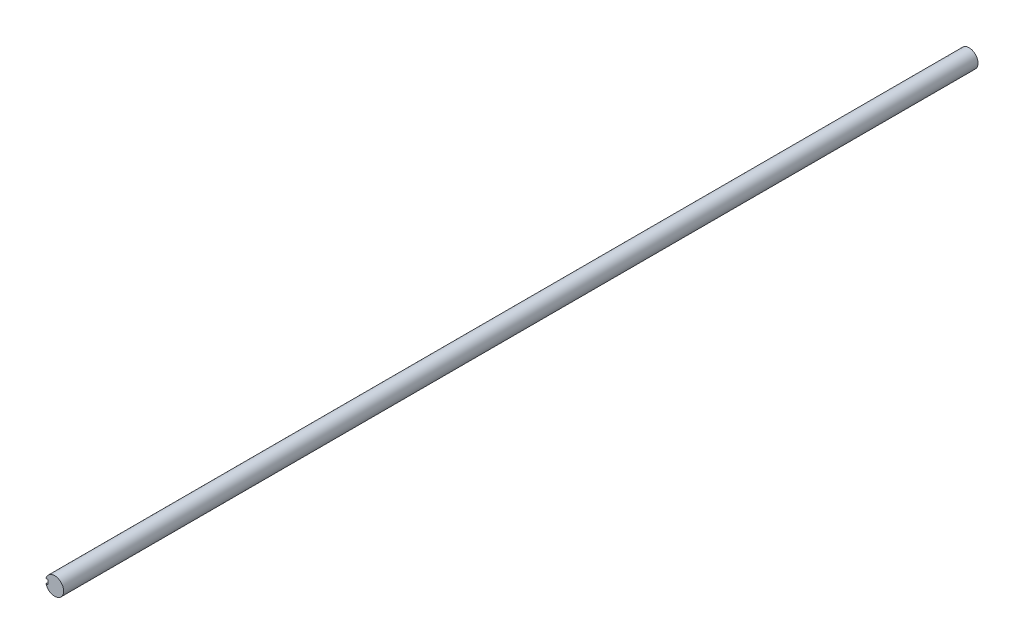
ISO-10303-21;
HEADER;
FILE_DESCRIPTION(('STEP AP214'),'2;1');
FILE_NAME('part.step','',(''),(''),'','','');
FILE_SCHEMA(('AUTOMOTIVE_DESIGN { 1 0 10303 214 1 1 1 1 }'));
ENDSEC;
DATA;
#1=APPLICATION_CONTEXT('core data for automotive mechanical design processes');
#2=APPLICATION_PROTOCOL_DEFINITION('international standard','automotive_design',2000,#1);
#3=PRODUCT_CONTEXT('',#1,'mechanical');
#4=PRODUCT('Part','Part','',(#3));
#5=PRODUCT_RELATED_PRODUCT_CATEGORY('part','',(#4));
#6=PRODUCT_DEFINITION_FORMATION('','',#4);
#7=PRODUCT_DEFINITION_CONTEXT('part definition',#1,'design');
#8=PRODUCT_DEFINITION('design','',#6,#7);
#9=PRODUCT_DEFINITION_SHAPE('','',#8);
#10=(LENGTH_UNIT() NAMED_UNIT(*) SI_UNIT(.MILLI.,.METRE.));
#11=(NAMED_UNIT(*) PLANE_ANGLE_UNIT() SI_UNIT($,.RADIAN.));
#12=(NAMED_UNIT(*) SI_UNIT($,.STERADIAN.) SOLID_ANGLE_UNIT());
#13=UNCERTAINTY_MEASURE_WITH_UNIT(LENGTH_MEASURE(1.E-05),#10,'distance_accuracy_value','');
#14=(GEOMETRIC_REPRESENTATION_CONTEXT(3) GLOBAL_UNCERTAINTY_ASSIGNED_CONTEXT((#13)) GLOBAL_UNIT_ASSIGNED_CONTEXT((#10,
#11,#12)) REPRESENTATION_CONTEXT('',''));
#15=CARTESIAN_POINT('',(0.,0.,0.));
#16=DIRECTION('',(0.,0.,1.));
#17=DIRECTION('',(1.,0.,0.));
#18=AXIS2_PLACEMENT_3D('',#15,#16,#17);
#19=CARTESIAN_POINT('',(0.,0.,486.69575));
#20=DIRECTION('',(0.,0.,-1.));
#21=DIRECTION('',(-1.,0.,0.));
#22=AXIS2_PLACEMENT_3D('',#19,#20,#21);
#23=CYLINDRICAL_SURFACE('',#22,4.7625);
#24=CARTESIAN_POINT('',(0.,0.,0.));
#25=DIRECTION('',(0.,0.,1.));
#26=DIRECTION('',(1.,0.,0.));
#27=AXIS2_PLACEMENT_3D('',#24,#25,#26);
#28=CIRCLE('',#27,4.7625);
#29=CARTESIAN_POINT('',(-4.61127079657821,-1.190625,0.));
#30=VERTEX_POINT('',#29);
#31=CARTESIAN_POINT('',(-4.61127079657821,1.190625,0.));
#32=VERTEX_POINT('',#31);
#33=EDGE_CURVE('E95',#30,#32,#28,.T.);
#34=ORIENTED_EDGE('',*,*,#33,.T.);
#35=DIRECTION('',(0.,0.,-1.));
#36=VECTOR('',#35,1.);
#37=CARTESIAN_POINT('',(-4.61127079657821,1.190625,486.69575));
#38=LINE('',#37,#36);
#39=CARTESIAN_POINT('',(-4.61127079657821,1.190625,486.69575));
#40=VERTEX_POINT('',#39);
#41=EDGE_CURVE('E11',#40,#32,#38,.T.);
#42=ORIENTED_EDGE('',*,*,#41,.F.);
#43=CARTESIAN_POINT('',(0.,0.,486.69575));
#44=DIRECTION('',(0.,0.,1.));
#45=DIRECTION('',(1.,0.,0.));
#46=AXIS2_PLACEMENT_3D('',#43,#44,#45);
#47=CIRCLE('',#46,4.7625);
#48=CARTESIAN_POINT('',(-4.61127079657821,-1.190625,486.69575));
#49=VERTEX_POINT('',#48);
#50=EDGE_CURVE('E83',#49,#40,#47,.T.);
#51=ORIENTED_EDGE('',*,*,#50,.F.);
#52=DIRECTION('',(0.,0.,-1.));
#53=VECTOR('',#52,1.);
#54=CARTESIAN_POINT('',(-4.61127079657821,-1.190625,486.69575));
#55=LINE('',#54,#53);
#56=EDGE_CURVE('E91',#49,#30,#55,.T.);
#57=ORIENTED_EDGE('',*,*,#56,.T.);
#58=EDGE_LOOP('',(#34,#42,#51,#57));
#59=FACE_BOUND('',#58,.T.);
#60=ADVANCED_FACE('F32',(#59),#23,.T.);
#61=CARTESIAN_POINT('',(-4.61127079657821,1.190625,486.69575));
#62=DIRECTION('',(0.,1.,0.));
#63=DIRECTION('',(-1.,0.,0.));
#64=AXIS2_PLACEMENT_3D('',#61,#62,#63);
#65=PLANE('',#64);
#66=DIRECTION('',(1.,0.,0.));
#67=VECTOR('',#66,1.);
#68=CARTESIAN_POINT('',(-4.61127079657821,1.190625,0.));
#69=LINE('',#68,#67);
#70=CARTESIAN_POINT('',(-3.571875,1.190625,0.));
#71=VERTEX_POINT('',#70);
#72=EDGE_CURVE('E87',#32,#71,#69,.T.);
#73=ORIENTED_EDGE('',*,*,#72,.T.);
#74=DIRECTION('',(0.,0.,-1.));
#75=VECTOR('',#74,1.);
#76=CARTESIAN_POINT('',(-3.571875,1.190625,486.69575));
#77=LINE('',#76,#75);
#78=CARTESIAN_POINT('',(-3.571875,1.190625,486.69575));
#79=VERTEX_POINT('',#78);
#80=EDGE_CURVE('E40',#79,#71,#77,.T.);
#81=ORIENTED_EDGE('',*,*,#80,.F.);
#82=DIRECTION('',(1.,0.,0.));
#83=VECTOR('',#82,1.);
#84=CARTESIAN_POINT('',(-4.61127079657821,1.190625,486.69575));
#85=LINE('',#84,#83);
#86=EDGE_CURVE('E78',#40,#79,#85,.T.);
#87=ORIENTED_EDGE('',*,*,#86,.F.);
#88=ORIENTED_EDGE('',*,*,#41,.T.);
#89=EDGE_LOOP('',(#73,#81,#87,#88));
#90=FACE_BOUND('',#89,.T.);
#91=ADVANCED_FACE('F86',(#90),#65,.F.);
#92=CARTESIAN_POINT('',(-3.571875,1.190625,486.69575));
#93=DIRECTION('',(1.,0.,0.));
#94=DIRECTION('',(0.,1.,0.));
#95=AXIS2_PLACEMENT_3D('',#92,#93,#94);
#96=PLANE('',#95);
#97=DIRECTION('',(0.,-1.,0.));
#98=VECTOR('',#97,1.);
#99=CARTESIAN_POINT('',(-3.571875,1.190625,0.));
#100=LINE('',#99,#98);
#101=CARTESIAN_POINT('',(-3.571875,-1.190625,0.));
#102=VERTEX_POINT('',#101);
#103=EDGE_CURVE('E65',#71,#102,#100,.T.);
#104=ORIENTED_EDGE('',*,*,#103,.T.);
#105=DIRECTION('',(0.,0.,-1.));
#106=VECTOR('',#105,1.);
#107=CARTESIAN_POINT('',(-3.571875,-1.190625,486.69575));
#108=LINE('',#107,#106);
#109=CARTESIAN_POINT('',(-3.571875,-1.190625,486.69575));
#110=VERTEX_POINT('',#109);
#111=EDGE_CURVE('E88',#110,#102,#108,.T.);
#112=ORIENTED_EDGE('',*,*,#111,.F.);
#113=DIRECTION('',(0.,-1.,0.));
#114=VECTOR('',#113,1.);
#115=CARTESIAN_POINT('',(-3.571875,1.190625,486.69575));
#116=LINE('',#115,#114);
#117=EDGE_CURVE('E81',#79,#110,#116,.T.);
#118=ORIENTED_EDGE('',*,*,#117,.F.);
#119=ORIENTED_EDGE('',*,*,#80,.T.);
#120=EDGE_LOOP('',(#104,#112,#118,#119));
#121=FACE_BOUND('',#120,.T.);
#122=ADVANCED_FACE('F89',(#121),#96,.F.);
#123=CARTESIAN_POINT('',(-4.61127079657821,-1.190625,486.69575));
#124=DIRECTION('',(0.,-1.,0.));
#125=DIRECTION('',(0.,0.,-1.));
#126=AXIS2_PLACEMENT_3D('',#123,#124,#125);
#127=PLANE('',#126);
#128=DIRECTION('',(-1.,0.,0.));
#129=VECTOR('',#128,1.);
#130=CARTESIAN_POINT('',(-4.61127079657821,-1.190625,0.));
#131=LINE('',#130,#129);
#132=EDGE_CURVE('E71',#102,#30,#131,.T.);
#133=ORIENTED_EDGE('',*,*,#132,.T.);
#134=ORIENTED_EDGE('',*,*,#56,.F.);
#135=DIRECTION('',(-1.,0.,0.));
#136=VECTOR('',#135,1.);
#137=CARTESIAN_POINT('',(-4.61127079657821,-1.190625,486.69575));
#138=LINE('',#137,#136);
#139=EDGE_CURVE('E48',#110,#49,#138,.T.);
#140=ORIENTED_EDGE('',*,*,#139,.F.);
#141=ORIENTED_EDGE('',*,*,#111,.T.);
#142=EDGE_LOOP('',(#133,#134,#140,#141));
#143=FACE_BOUND('',#142,.T.);
#144=ADVANCED_FACE('F102',(#143),#127,.F.);
#145=CARTESIAN_POINT('',(0.,0.,486.69575));
#146=DIRECTION('',(0.,0.,1.));
#147=DIRECTION('',(1.,0.,0.));
#148=AXIS2_PLACEMENT_3D('',#145,#146,#147);
#149=PLANE('',#148);
#150=ORIENTED_EDGE('',*,*,#50,.T.);
#151=ORIENTED_EDGE('',*,*,#86,.T.);
#152=ORIENTED_EDGE('',*,*,#117,.T.);
#153=ORIENTED_EDGE('',*,*,#139,.T.);
#154=EDGE_LOOP('',(#150,#151,#152,#153));
#155=FACE_BOUND('',#154,.T.);
#156=ADVANCED_FACE('F79',(#155),#149,.T.);
#157=CARTESIAN_POINT('',(0.,0.,0.));
#158=DIRECTION('',(0.,0.,1.));
#159=DIRECTION('',(1.,0.,0.));
#160=AXIS2_PLACEMENT_3D('',#157,#158,#159);
#161=PLANE('',#160);
#162=ORIENTED_EDGE('',*,*,#33,.F.);
#163=ORIENTED_EDGE('',*,*,#132,.F.);
#164=ORIENTED_EDGE('',*,*,#103,.F.);
#165=ORIENTED_EDGE('',*,*,#72,.F.);
#166=EDGE_LOOP('',(#162,#163,#164,#165));
#167=FACE_BOUND('',#166,.T.);
#168=ADVANCED_FACE('F105',(#167),#161,.F.);
#169=CLOSED_SHELL('',(#60,#91,#122,#144,#156,#168));
#170=MANIFOLD_SOLID_BREP('B2',#169);
#171=ADVANCED_BREP_SHAPE_REPRESENTATION('',(#18,#170),#14);
#172=SHAPE_DEFINITION_REPRESENTATION(#9,#171);
ENDSEC;
END-ISO-10303-21;
